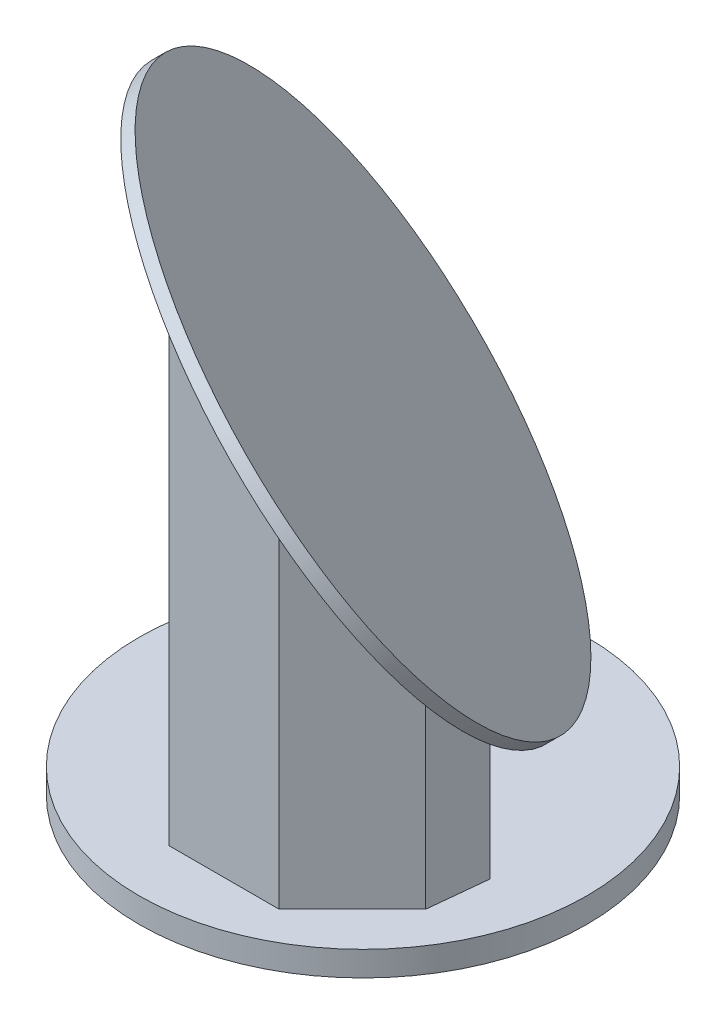
ISO-10303-21;
HEADER;
FILE_DESCRIPTION(('STEP AP214'),'2;1');
FILE_NAME('part.step','',(''),(''),'','','');
FILE_SCHEMA(('AUTOMOTIVE_DESIGN { 1 0 10303 214 1 1 1 1 }'));
ENDSEC;
DATA;
#1=APPLICATION_CONTEXT('core data for automotive mechanical design processes');
#2=APPLICATION_PROTOCOL_DEFINITION('international standard','automotive_design',2000,#1);
#3=PRODUCT_CONTEXT('',#1,'mechanical');
#4=PRODUCT('Part','Part','',(#3));
#5=PRODUCT_RELATED_PRODUCT_CATEGORY('part','',(#4));
#6=PRODUCT_DEFINITION_FORMATION('','',#4);
#7=PRODUCT_DEFINITION_CONTEXT('part definition',#1,'design');
#8=PRODUCT_DEFINITION('design','',#6,#7);
#9=PRODUCT_DEFINITION_SHAPE('','',#8);
#10=(LENGTH_UNIT() NAMED_UNIT(*) SI_UNIT(.MILLI.,.METRE.));
#11=(NAMED_UNIT(*) PLANE_ANGLE_UNIT() SI_UNIT($,.RADIAN.));
#12=(NAMED_UNIT(*) SI_UNIT($,.STERADIAN.) SOLID_ANGLE_UNIT());
#13=UNCERTAINTY_MEASURE_WITH_UNIT(LENGTH_MEASURE(1.E-05),#10,'distance_accuracy_value','');
#14=(GEOMETRIC_REPRESENTATION_CONTEXT(3) GLOBAL_UNCERTAINTY_ASSIGNED_CONTEXT((#13)) GLOBAL_UNIT_ASSIGNED_CONTEXT((#10,
#11,#12)) REPRESENTATION_CONTEXT('',''));
#15=CARTESIAN_POINT('',(0.,0.,0.));
#16=DIRECTION('',(0.,0.,1.));
#17=DIRECTION('',(1.,0.,0.));
#18=AXIS2_PLACEMENT_3D('',#15,#16,#17);
#19=CARTESIAN_POINT('',(-2.88675134594813,-2.88675134594813,2.88675134594813));
#20=DIRECTION('',(0.577350269189626,0.577350269189626,-0.577350269189626));
#21=DIRECTION('',(-0.707106781186547,0.707106781186548,0.));
#22=AXIS2_PLACEMENT_3D('',#19,#20,#21);
#23=CYLINDRICAL_SURFACE('',#22,112.5);
#24=CARTESIAN_POINT('',(-2.88675134594813,-2.88675134594813,2.88675134594813));
#25=DIRECTION('',(0.577350269189626,0.577350269189626,-0.577350269189626));
#26=DIRECTION('',(-0.707106781186547,0.707106781186548,0.));
#27=AXIS2_PLACEMENT_3D('',#24,#25,#26);
#28=CIRCLE('',#27,112.5);
#29=CARTESIAN_POINT('',(-82.4362642294347,76.6627615375385,2.88675134594813));
#30=VERTEX_POINT('',#29);
#31=EDGE_CURVE('E42',#30,#30,#28,.T.);
#32=ORIENTED_EDGE('',*,*,#31,.T.);
#33=EDGE_LOOP('',(#32));
#34=FACE_BOUND('',#33,.T.);
#35=CARTESIAN_POINT('',(0.,0.,0.));
#36=DIRECTION('',(0.577350269189626,0.577350269189626,-0.577350269189626));
#37=DIRECTION('',(-0.707106781186547,0.707106781186548,0.));
#38=AXIS2_PLACEMENT_3D('',#35,#36,#37);
#39=CIRCLE('',#38,112.5);
#40=CARTESIAN_POINT('',(-79.5495128834866,79.5495128834866,0.));
#41=VERTEX_POINT('',#40);
#42=EDGE_CURVE('E123',#41,#41,#39,.T.);
#43=ORIENTED_EDGE('',*,*,#42,.F.);
#44=EDGE_LOOP('',(#43));
#45=FACE_BOUND('',#44,.T.);
#46=ADVANCED_FACE('F35',(#34,#45),#23,.T.);
#47=CARTESIAN_POINT('',(-2.88675134594813,-2.88675134594813,2.88675134594813));
#48=DIRECTION('',(0.577350269189626,0.577350269189626,-0.577350269189626));
#49=DIRECTION('',(-0.707106781186547,0.707106781186548,0.));
#50=AXIS2_PLACEMENT_3D('',#47,#48,#49);
#51=PLANE('',#50);
#52=DIRECTION('',(0.0688120458466891,-0.738997164479776,-0.670185118633087));
#53=VECTOR('',#52,1.);
#54=CARTESIAN_POINT('',(49.2312657278288,107.974854918515,165.866374684188));
#55=LINE('',#54,#53);
#56=CARTESIAN_POINT('',(62.4465425244932,-33.9487277970577,37.1580687652798));
#57=VERTEX_POINT('',#56);
#58=CARTESIAN_POINT('',(64.8497631982149,-59.7577738971604,13.7522433388989));
#59=VERTEX_POINT('',#58);
#60=EDGE_CURVE('E125',#57,#59,#55,.T.);
#61=ORIENTED_EDGE('',*,*,#60,.T.);
#62=DIRECTION('',(-0.707106781186548,0.,-0.707106781186548));
#63=VECTOR('',#62,1.);
#64=CARTESIAN_POINT('',(64.8497631982148,-59.7577738971604,13.7522433388988));
#65=LINE('',#64,#63);
#66=CARTESIAN_POINT('',(-13.7522433388989,-59.7577738971604,-64.849763198215));
#67=VERTEX_POINT('',#66);
#68=EDGE_CURVE('E56',#59,#67,#65,.T.);
#69=ORIENTED_EDGE('',*,*,#68,.T.);
#70=DIRECTION('',(-0.670185118633087,0.738997164479776,0.0688120458466889));
#71=VECTOR('',#70,1.);
#72=CARTESIAN_POINT('',(-165.866374684188,107.974854918515,-49.2312657278289));
#73=LINE('',#72,#71);
#74=CARTESIAN_POINT('',(-37.1580687652798,-33.9487277970577,-62.4465425244932));
#75=VERTEX_POINT('',#74);
#76=EDGE_CURVE('E113',#67,#75,#73,.T.);
#77=ORIENTED_EDGE('',*,*,#76,.T.);
#78=DIRECTION('',(-0.408248290463863,0.816496580927726,0.408248290463863));
#79=VECTOR('',#78,1.);
#80=CARTESIAN_POINT('',(-130.934023134186,153.603180940754,31.3294118444126));
#81=LINE('',#80,#79);
#82=CARTESIAN_POINT('',(-66.7185975013221,25.1723296750269,-32.8860137884509));
#83=VERTEX_POINT('',#82);
#84=EDGE_CURVE('E145',#75,#83,#81,.T.);
#85=ORIENTED_EDGE('',*,*,#84,.T.);
#86=DIRECTION('',(0.,0.707106781186547,0.707106781186548));
#87=VECTOR('',#86,1.);
#88=CARTESIAN_POINT('',(-66.7185975013221,136.275732492343,78.2173890288655));
#89=LINE('',#88,#87);
#90=CARTESIAN_POINT('',(-66.7185975013221,69.5095087616511,11.4511652981734));
#91=VERTEX_POINT('',#90);
#92=EDGE_CURVE('E142',#83,#91,#89,.T.);
#93=ORIENTED_EDGE('',*,*,#92,.T.);
#94=DIRECTION('',(0.707106781186547,0.,0.707106781186548));
#95=VECTOR('',#94,1.);
#96=CARTESIAN_POINT('',(-66.7185975013221,69.5095087616511,11.4511652981733));
#97=LINE('',#96,#95);
#98=CARTESIAN_POINT('',(-11.4511652981734,69.5095087616511,66.7185975013221));
#99=VERTEX_POINT('',#98);
#100=EDGE_CURVE('E139',#91,#99,#97,.T.);
#101=ORIENTED_EDGE('',*,*,#100,.T.);
#102=DIRECTION('',(0.707106781186547,-0.707106781186548,0.));
#103=VECTOR('',#102,1.);
#104=CARTESIAN_POINT('',(-78.2173890288656,136.275732492343,66.7185975013221));
#105=LINE('',#104,#103);
#106=CARTESIAN_POINT('',(32.8860137884509,25.1723296750267,66.7185975013221));
#107=VERTEX_POINT('',#106);
#108=EDGE_CURVE('E132',#99,#107,#105,.T.);
#109=ORIENTED_EDGE('',*,*,#108,.T.);
#110=DIRECTION('',(0.408248290463863,-0.816496580927726,-0.408248290463863));
#111=VECTOR('',#110,1.);
#112=CARTESIAN_POINT('',(-31.3294118444126,153.603180940754,130.934023134186));
#113=LINE('',#112,#111);
#114=EDGE_CURVE('E128',#107,#57,#113,.T.);
#115=ORIENTED_EDGE('',*,*,#114,.T.);
#116=EDGE_LOOP('',(#61,#69,#77,#85,#93,#101,#109,#115));
#117=FACE_BOUND('',#116,.T.);
#118=ORIENTED_EDGE('',*,*,#31,.F.);
#119=EDGE_LOOP('',(#118));
#120=FACE_BOUND('',#119,.T.);
#121=ADVANCED_FACE('F169',(#117,#120),#51,.F.);
#122=CARTESIAN_POINT('',(0.,0.,0.));
#123=DIRECTION('',(0.577350269189626,0.577350269189626,-0.577350269189626));
#124=DIRECTION('',(-0.707106781186547,0.707106781186548,0.));
#125=AXIS2_PLACEMENT_3D('',#122,#123,#124);
#126=PLANE('',#125);
#127=ORIENTED_EDGE('',*,*,#42,.T.);
#128=EDGE_LOOP('',(#127));
#129=FACE_BOUND('',#128,.T.);
#130=ADVANCED_FACE('F212',(#129),#126,.T.);
#131=CARTESIAN_POINT('',(-13.752243338899,247.37913530966,-64.849763198215));
#132=DIRECTION('',(0.102139192565155,0.,0.994770116832094));
#133=DIRECTION('',(0.994770116832094,0.,-0.102139192565155));
#134=AXIS2_PLACEMENT_3D('',#131,#132,#133);
#135=PLANE('',#134);
#136=DIRECTION('',(0.,-1.,0.));
#137=VECTOR('',#136,1.);
#138=CARTESIAN_POINT('',(-13.752243338899,247.37913530966,-64.849763198215));
#139=LINE('',#138,#137);
#140=CARTESIAN_POINT('',(-13.752243338899,-130.,-64.849763198215));
#141=VERTEX_POINT('',#140);
#142=EDGE_CURVE('E119',#67,#141,#139,.T.);
#143=ORIENTED_EDGE('',*,*,#142,.T.);
#144=DIRECTION('',(-0.994770116832094,0.,0.102139192565155));
#145=VECTOR('',#144,1.);
#146=CARTESIAN_POINT('',(-13.752243338899,-130.,-64.849763198215));
#147=LINE('',#146,#145);
#148=CARTESIAN_POINT('',(-37.1580687652798,-130.,-62.4465425244932));
#149=VERTEX_POINT('',#148);
#150=EDGE_CURVE('E49',#141,#149,#147,.T.);
#151=ORIENTED_EDGE('',*,*,#150,.T.);
#152=DIRECTION('',(0.,-1.,0.));
#153=VECTOR('',#152,1.);
#154=CARTESIAN_POINT('',(-37.1580687652798,247.37913530966,-62.4465425244932));
#155=LINE('',#154,#153);
#156=EDGE_CURVE('E121',#75,#149,#155,.T.);
#157=ORIENTED_EDGE('',*,*,#156,.F.);
#158=ORIENTED_EDGE('',*,*,#76,.F.);
#159=EDGE_LOOP('',(#143,#151,#157,#158));
#160=FACE_BOUND('',#159,.T.);
#161=ADVANCED_FACE('F219',(#160),#135,.F.);
#162=CARTESIAN_POINT('',(-37.1580687652798,247.37913530966,-62.4465425244932));
#163=DIRECTION('',(0.707106781186547,0.,0.707106781186548));
#164=DIRECTION('',(0.707106781186548,0.,-0.707106781186547));
#165=AXIS2_PLACEMENT_3D('',#162,#163,#164);
#166=PLANE('',#165);
#167=ORIENTED_EDGE('',*,*,#156,.T.);
#168=DIRECTION('',(-0.707106781186548,0.,0.707106781186547));
#169=VECTOR('',#168,1.);
#170=CARTESIAN_POINT('',(-37.1580687652798,-130.,-62.4465425244932));
#171=LINE('',#170,#169);
#172=CARTESIAN_POINT('',(-66.7185975013221,-130.,-32.8860137884509));
#173=VERTEX_POINT('',#172);
#174=EDGE_CURVE('E181',#149,#173,#171,.T.);
#175=ORIENTED_EDGE('',*,*,#174,.T.);
#176=DIRECTION('',(0.,-1.,0.));
#177=VECTOR('',#176,1.);
#178=CARTESIAN_POINT('',(-66.7185975013221,247.37913530966,-32.8860137884509));
#179=LINE('',#178,#177);
#180=EDGE_CURVE('E152',#83,#173,#179,.T.);
#181=ORIENTED_EDGE('',*,*,#180,.F.);
#182=ORIENTED_EDGE('',*,*,#84,.F.);
#183=EDGE_LOOP('',(#167,#175,#181,#182));
#184=FACE_BOUND('',#183,.T.);
#185=ADVANCED_FACE('F223',(#184),#166,.F.);
#186=CARTESIAN_POINT('',(-66.7185975013221,247.37913530966,-32.8860137884509));
#187=DIRECTION('',(1.,0.,0.));
#188=DIRECTION('',(0.,0.,-1.));
#189=AXIS2_PLACEMENT_3D('',#186,#187,#188);
#190=PLANE('',#189);
#191=ORIENTED_EDGE('',*,*,#180,.T.);
#192=DIRECTION('',(0.,0.,1.));
#193=VECTOR('',#192,1.);
#194=CARTESIAN_POINT('',(-66.7185975013221,-130.,-32.8860137884509));
#195=LINE('',#194,#193);
#196=CARTESIAN_POINT('',(-66.7185975013221,-130.,11.4511652981734));
#197=VERTEX_POINT('',#196);
#198=EDGE_CURVE('E179',#173,#197,#195,.T.);
#199=ORIENTED_EDGE('',*,*,#198,.T.);
#200=DIRECTION('',(0.,-1.,0.));
#201=VECTOR('',#200,1.);
#202=CARTESIAN_POINT('',(-66.7185975013221,247.37913530966,11.4511652981734));
#203=LINE('',#202,#201);
#204=EDGE_CURVE('E155',#91,#197,#203,.T.);
#205=ORIENTED_EDGE('',*,*,#204,.F.);
#206=ORIENTED_EDGE('',*,*,#92,.F.);
#207=EDGE_LOOP('',(#191,#199,#205,#206));
#208=FACE_BOUND('',#207,.T.);
#209=ADVANCED_FACE('F177',(#208),#190,.F.);
#210=CARTESIAN_POINT('',(-66.7185975013221,247.37913530966,11.4511652981734));
#211=DIRECTION('',(0.707106781186548,0.,-0.707106781186547));
#212=DIRECTION('',(-0.707106781186547,0.,-0.707106781186548));
#213=AXIS2_PLACEMENT_3D('',#210,#211,#212);
#214=PLANE('',#213);
#215=ORIENTED_EDGE('',*,*,#204,.T.);
#216=DIRECTION('',(0.707106781186547,0.,0.707106781186548));
#217=VECTOR('',#216,1.);
#218=CARTESIAN_POINT('',(-66.7185975013221,-130.,11.4511652981734));
#219=LINE('',#218,#217);
#220=CARTESIAN_POINT('',(-11.4511652981734,-130.,66.7185975013221));
#221=VERTEX_POINT('',#220);
#222=EDGE_CURVE('E182',#197,#221,#219,.T.);
#223=ORIENTED_EDGE('',*,*,#222,.T.);
#224=DIRECTION('',(0.,-1.,0.));
#225=VECTOR('',#224,1.);
#226=CARTESIAN_POINT('',(-11.4511652981734,247.37913530966,66.7185975013221));
#227=LINE('',#226,#225);
#228=EDGE_CURVE('E158',#99,#221,#227,.T.);
#229=ORIENTED_EDGE('',*,*,#228,.F.);
#230=ORIENTED_EDGE('',*,*,#100,.F.);
#231=EDGE_LOOP('',(#215,#223,#229,#230));
#232=FACE_BOUND('',#231,.T.);
#233=ADVANCED_FACE('F173',(#232),#214,.F.);
#234=CARTESIAN_POINT('',(32.8860137884509,247.37913530966,66.7185975013221));
#235=DIRECTION('',(0.,0.,-1.));
#236=DIRECTION('',(-1.,0.,0.));
#237=AXIS2_PLACEMENT_3D('',#234,#235,#236);
#238=PLANE('',#237);
#239=ORIENTED_EDGE('',*,*,#228,.T.);
#240=DIRECTION('',(1.,0.,0.));
#241=VECTOR('',#240,1.);
#242=CARTESIAN_POINT('',(32.8860137884509,-130.,66.7185975013221));
#243=LINE('',#242,#241);
#244=CARTESIAN_POINT('',(32.8860137884509,-130.,66.7185975013221));
#245=VERTEX_POINT('',#244);
#246=EDGE_CURVE('E168',#221,#245,#243,.T.);
#247=ORIENTED_EDGE('',*,*,#246,.T.);
#248=DIRECTION('',(0.,-1.,0.));
#249=VECTOR('',#248,1.);
#250=CARTESIAN_POINT('',(32.8860137884509,247.37913530966,66.7185975013221));
#251=LINE('',#250,#249);
#252=EDGE_CURVE('E115',#107,#245,#251,.T.);
#253=ORIENTED_EDGE('',*,*,#252,.F.);
#254=ORIENTED_EDGE('',*,*,#108,.F.);
#255=EDGE_LOOP('',(#239,#247,#253,#254));
#256=FACE_BOUND('',#255,.T.);
#257=ADVANCED_FACE('F166',(#256),#238,.F.);
#258=CARTESIAN_POINT('',(62.4465425244932,247.37913530966,37.1580687652798));
#259=DIRECTION('',(-0.707106781186548,0.,-0.707106781186547));
#260=DIRECTION('',(-0.707106781186547,0.,0.707106781186548));
#261=AXIS2_PLACEMENT_3D('',#258,#259,#260);
#262=PLANE('',#261);
#263=ORIENTED_EDGE('',*,*,#252,.T.);
#264=DIRECTION('',(0.707106781186547,0.,-0.707106781186548));
#265=VECTOR('',#264,1.);
#266=CARTESIAN_POINT('',(62.4465425244932,-130.,37.1580687652798));
#267=LINE('',#266,#265);
#268=CARTESIAN_POINT('',(62.4465425244932,-130.,37.1580687652798));
#269=VERTEX_POINT('',#268);
#270=EDGE_CURVE('E108',#245,#269,#267,.T.);
#271=ORIENTED_EDGE('',*,*,#270,.T.);
#272=DIRECTION('',(0.,-1.,0.));
#273=VECTOR('',#272,1.);
#274=CARTESIAN_POINT('',(62.4465425244932,247.37913530966,37.1580687652798));
#275=LINE('',#274,#273);
#276=EDGE_CURVE('E107',#57,#269,#275,.T.);
#277=ORIENTED_EDGE('',*,*,#276,.F.);
#278=ORIENTED_EDGE('',*,*,#114,.F.);
#279=EDGE_LOOP('',(#263,#271,#277,#278));
#280=FACE_BOUND('',#279,.T.);
#281=ADVANCED_FACE('F163',(#280),#262,.F.);
#282=CARTESIAN_POINT('',(64.8497631982149,247.37913530966,13.7522433388989));
#283=DIRECTION('',(-0.994770116832094,0.,-0.102139192565155));
#284=DIRECTION('',(-0.102139192565155,0.,0.994770116832094));
#285=AXIS2_PLACEMENT_3D('',#282,#283,#284);
#286=PLANE('',#285);
#287=ORIENTED_EDGE('',*,*,#276,.T.);
#288=DIRECTION('',(0.102139192565155,0.,-0.994770116832094));
#289=VECTOR('',#288,1.);
#290=CARTESIAN_POINT('',(64.8497631982149,-130.,13.7522433388989));
#291=LINE('',#290,#289);
#292=CARTESIAN_POINT('',(64.8497631982149,-130.,13.7522433388989));
#293=VERTEX_POINT('',#292);
#294=EDGE_CURVE('E98',#269,#293,#291,.T.);
#295=ORIENTED_EDGE('',*,*,#294,.T.);
#296=DIRECTION('',(0.,-1.,0.));
#297=VECTOR('',#296,1.);
#298=CARTESIAN_POINT('',(64.8497631982149,247.37913530966,13.7522433388989));
#299=LINE('',#298,#297);
#300=EDGE_CURVE('E104',#59,#293,#299,.T.);
#301=ORIENTED_EDGE('',*,*,#300,.F.);
#302=ORIENTED_EDGE('',*,*,#60,.F.);
#303=EDGE_LOOP('',(#287,#295,#301,#302));
#304=FACE_BOUND('',#303,.T.);
#305=ADVANCED_FACE('F103',(#304),#286,.F.);
#306=CARTESIAN_POINT('',(64.8497631982149,247.37913530966,13.7522433388989));
#307=DIRECTION('',(-0.707106781186548,0.,0.707106781186548));
#308=DIRECTION('',(0.707106781186548,0.,0.707106781186548));
#309=AXIS2_PLACEMENT_3D('',#306,#307,#308);
#310=PLANE('',#309);
#311=ORIENTED_EDGE('',*,*,#300,.T.);
#312=DIRECTION('',(-0.707106781186548,0.,-0.707106781186548));
#313=VECTOR('',#312,1.);
#314=CARTESIAN_POINT('',(64.8497631982149,-130.,13.7522433388989));
#315=LINE('',#314,#313);
#316=EDGE_CURVE('E11',#293,#141,#315,.T.);
#317=ORIENTED_EDGE('',*,*,#316,.T.);
#318=ORIENTED_EDGE('',*,*,#142,.F.);
#319=ORIENTED_EDGE('',*,*,#68,.F.);
#320=EDGE_LOOP('',(#311,#317,#318,#319));
#321=FACE_BOUND('',#320,.T.);
#322=ADVANCED_FACE('F111',(#321),#310,.F.);
#323=CARTESIAN_POINT('',(0.,-130.,0.));
#324=DIRECTION('',(0.,1.,0.));
#325=DIRECTION('',(0.,0.,1.));
#326=AXIS2_PLACEMENT_3D('',#323,#324,#325);
#327=PLANE('',#326);
#328=CARTESIAN_POINT('',(0.,-130.,0.));
#329=DIRECTION('',(0.,1.,0.));
#330=DIRECTION('',(0.,0.,1.));
#331=AXIS2_PLACEMENT_3D('',#328,#329,#330);
#332=CIRCLE('',#331,90.2477054604735);
#333=CARTESIAN_POINT('',(0.,-130.,90.2477054604735));
#334=VERTEX_POINT('',#333);
#335=EDGE_CURVE('E109',#334,#334,#332,.T.);
#336=ORIENTED_EDGE('',*,*,#335,.T.);
#337=EDGE_LOOP('',(#336));
#338=FACE_BOUND('',#337,.T.);
#339=ORIENTED_EDGE('',*,*,#150,.F.);
#340=ORIENTED_EDGE('',*,*,#316,.F.);
#341=ORIENTED_EDGE('',*,*,#294,.F.);
#342=ORIENTED_EDGE('',*,*,#270,.F.);
#343=ORIENTED_EDGE('',*,*,#246,.F.);
#344=ORIENTED_EDGE('',*,*,#222,.F.);
#345=ORIENTED_EDGE('',*,*,#198,.F.);
#346=ORIENTED_EDGE('',*,*,#174,.F.);
#347=EDGE_LOOP('',(#339,#340,#341,#342,#343,#344,#345,#346));
#348=FACE_BOUND('',#347,.T.);
#349=ADVANCED_FACE('F97',(#338,#348),#327,.T.);
#350=CARTESIAN_POINT('',(0.,-130.,0.));
#351=DIRECTION('',(0.,-1.,0.));
#352=DIRECTION('',(0.,0.,-1.));
#353=AXIS2_PLACEMENT_3D('',#350,#351,#352);
#354=CYLINDRICAL_SURFACE('',#353,90.2477054604735);
#355=ORIENTED_EDGE('',*,*,#335,.F.);
#356=EDGE_LOOP('',(#355));
#357=FACE_BOUND('',#356,.T.);
#358=CARTESIAN_POINT('',(0.,-140.,0.));
#359=DIRECTION('',(0.,1.,0.));
#360=DIRECTION('',(0.,0.,1.));
#361=AXIS2_PLACEMENT_3D('',#358,#359,#360);
#362=CIRCLE('',#361,90.2477054604735);
#363=CARTESIAN_POINT('',(0.,-140.,90.2477054604735));
#364=VERTEX_POINT('',#363);
#365=EDGE_CURVE('E188',#364,#364,#362,.T.);
#366=ORIENTED_EDGE('',*,*,#365,.T.);
#367=EDGE_LOOP('',(#366));
#368=FACE_BOUND('',#367,.T.);
#369=ADVANCED_FACE('F195',(#357,#368),#354,.T.);
#370=CARTESIAN_POINT('',(0.,-140.,0.));
#371=DIRECTION('',(0.,1.,0.));
#372=DIRECTION('',(0.,0.,1.));
#373=AXIS2_PLACEMENT_3D('',#370,#371,#372);
#374=PLANE('',#373);
#375=ORIENTED_EDGE('',*,*,#365,.F.);
#376=EDGE_LOOP('',(#375));
#377=FACE_BOUND('',#376,.T.);
#378=ADVANCED_FACE('F198',(#377),#374,.F.);
#379=CLOSED_SHELL('',(#46,#121,#130,#161,#185,#209,#233,#257,#281,#305,#322,#349,#369,#378));
#380=MANIFOLD_SOLID_BREP('B2',#379);
#381=ADVANCED_BREP_SHAPE_REPRESENTATION('',(#18,#380),#14);
#382=SHAPE_DEFINITION_REPRESENTATION(#9,#381);
ENDSEC;
END-ISO-10303-21;
